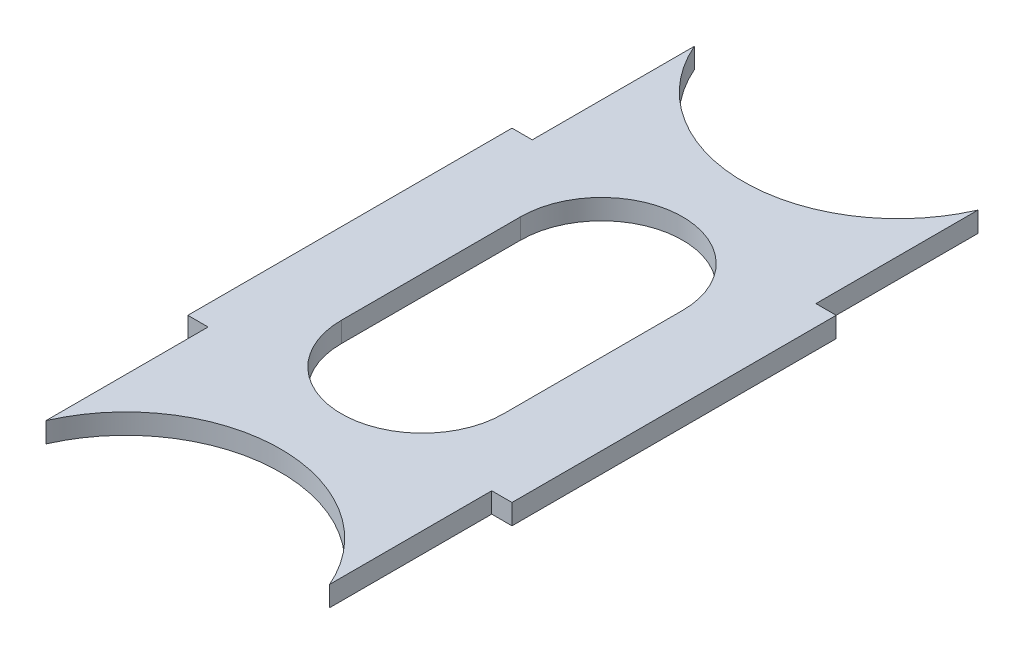
ISO-10303-21;
HEADER;
FILE_DESCRIPTION(('STEP AP214'),'2;1');
FILE_NAME('part.step','',(''),(''),'','','');
FILE_SCHEMA(('AUTOMOTIVE_DESIGN { 1 0 10303 214 1 1 1 1 }'));
ENDSEC;
DATA;
#1=APPLICATION_CONTEXT('core data for automotive mechanical design processes');
#2=APPLICATION_PROTOCOL_DEFINITION('international standard','automotive_design',2000,#1);
#3=PRODUCT_CONTEXT('',#1,'mechanical');
#4=PRODUCT('Part','Part','',(#3));
#5=PRODUCT_RELATED_PRODUCT_CATEGORY('part','',(#4));
#6=PRODUCT_DEFINITION_FORMATION('','',#4);
#7=PRODUCT_DEFINITION_CONTEXT('part definition',#1,'design');
#8=PRODUCT_DEFINITION('design','',#6,#7);
#9=PRODUCT_DEFINITION_SHAPE('','',#8);
#10=(LENGTH_UNIT() NAMED_UNIT(*) SI_UNIT(.MILLI.,.METRE.));
#11=(NAMED_UNIT(*) PLANE_ANGLE_UNIT() SI_UNIT($,.RADIAN.));
#12=(NAMED_UNIT(*) SI_UNIT($,.STERADIAN.) SOLID_ANGLE_UNIT());
#13=UNCERTAINTY_MEASURE_WITH_UNIT(LENGTH_MEASURE(1.E-05),#10,'distance_accuracy_value','');
#14=(GEOMETRIC_REPRESENTATION_CONTEXT(3) GLOBAL_UNCERTAINTY_ASSIGNED_CONTEXT((#13)) GLOBAL_UNIT_ASSIGNED_CONTEXT((#10,
#11,#12)) REPRESENTATION_CONTEXT('',''));
#15=CARTESIAN_POINT('',(0.,0.,0.));
#16=DIRECTION('',(0.,0.,1.));
#17=DIRECTION('',(1.,0.,0.));
#18=AXIS2_PLACEMENT_3D('',#15,#16,#17);
#19=CARTESIAN_POINT('',(0.,1.5875,-30.26171875));
#20=DIRECTION('',(0.,-1.,0.));
#21=DIRECTION('',(0.,0.,-1.));
#22=AXIS2_PLACEMENT_3D('',#19,#20,#21);
#23=CYLINDRICAL_SURFACE('',#22,12.1294668248073);
#24=CARTESIAN_POINT('',(0.,0.,-30.26171875));
#25=DIRECTION('',(0.,1.,0.));
#26=DIRECTION('',(0.,0.,1.));
#27=AXIS2_PLACEMENT_3D('',#24,#25,#26);
#28=CIRCLE('',#27,12.1294668248073);
#29=CARTESIAN_POINT('',(-11.1125,0.,-25.4));
#30=VERTEX_POINT('',#29);
#31=CARTESIAN_POINT('',(11.1125,0.,-25.4));
#32=VERTEX_POINT('',#31);
#33=EDGE_CURVE('E235',#30,#32,#28,.T.);
#34=ORIENTED_EDGE('',*,*,#33,.F.);
#35=DIRECTION('',(0.,-1.,0.));
#36=VECTOR('',#35,1.);
#37=CARTESIAN_POINT('',(-11.1125,1.5875,-25.4));
#38=LINE('',#37,#36);
#39=CARTESIAN_POINT('',(-11.1125,1.5875,-25.4));
#40=VERTEX_POINT('',#39);
#41=EDGE_CURVE('E11',#40,#30,#38,.T.);
#42=ORIENTED_EDGE('',*,*,#41,.F.);
#43=CARTESIAN_POINT('',(0.,1.5875,-30.26171875));
#44=DIRECTION('',(0.,1.,0.));
#45=DIRECTION('',(0.,0.,1.));
#46=AXIS2_PLACEMENT_3D('',#43,#44,#45);
#47=CIRCLE('',#46,12.1294668248073);
#48=CARTESIAN_POINT('',(11.1125,1.5875,-25.4));
#49=VERTEX_POINT('',#48);
#50=EDGE_CURVE('E268',#40,#49,#47,.T.);
#51=ORIENTED_EDGE('',*,*,#50,.T.);
#52=DIRECTION('',(0.,-1.,0.));
#53=VECTOR('',#52,1.);
#54=CARTESIAN_POINT('',(11.1125,1.5875,-25.4));
#55=LINE('',#54,#53);
#56=EDGE_CURVE('E55',#49,#32,#55,.T.);
#57=ORIENTED_EDGE('',*,*,#56,.T.);
#58=EDGE_LOOP('',(#34,#42,#51,#57));
#59=FACE_BOUND('',#58,.T.);
#60=ADVANCED_FACE('F36',(#59),#23,.F.);
#61=CARTESIAN_POINT('',(-11.1125,1.5875,0.));
#62=DIRECTION('',(1.,0.,0.));
#63=DIRECTION('',(0.,0.,-1.));
#64=AXIS2_PLACEMENT_3D('',#61,#62,#63);
#65=PLANE('',#64);
#66=DIRECTION('',(0.,0.,1.));
#67=VECTOR('',#66,1.);
#68=CARTESIAN_POINT('',(-11.1125,0.,0.));
#69=LINE('',#68,#67);
#70=CARTESIAN_POINT('',(-11.1125,0.,-12.7));
#71=VERTEX_POINT('',#70);
#72=EDGE_CURVE('E232',#30,#71,#69,.T.);
#73=ORIENTED_EDGE('',*,*,#72,.T.);
#74=DIRECTION('',(0.,-1.,0.));
#75=VECTOR('',#74,1.);
#76=CARTESIAN_POINT('',(-11.1125,1.5875,-12.7));
#77=LINE('',#76,#75);
#78=CARTESIAN_POINT('',(-11.1125,1.5875,-12.7));
#79=VERTEX_POINT('',#78);
#80=EDGE_CURVE('E46',#79,#71,#77,.T.);
#81=ORIENTED_EDGE('',*,*,#80,.F.);
#82=DIRECTION('',(0.,0.,1.));
#83=VECTOR('',#82,1.);
#84=CARTESIAN_POINT('',(-11.1125,1.5875,0.));
#85=LINE('',#84,#83);
#86=EDGE_CURVE('E266',#40,#79,#85,.T.);
#87=ORIENTED_EDGE('',*,*,#86,.F.);
#88=ORIENTED_EDGE('',*,*,#41,.T.);
#89=EDGE_LOOP('',(#73,#81,#87,#88));
#90=FACE_BOUND('',#89,.T.);
#91=ADVANCED_FACE('F302',(#90),#65,.F.);
#92=CARTESIAN_POINT('',(0.,1.5875,-12.7));
#93=DIRECTION('',(0.,0.,-1.));
#94=DIRECTION('',(-1.,0.,0.));
#95=AXIS2_PLACEMENT_3D('',#92,#93,#94);
#96=PLANE('',#95);
#97=DIRECTION('',(1.,0.,0.));
#98=VECTOR('',#97,1.);
#99=CARTESIAN_POINT('',(0.,0.,-12.7));
#100=LINE('',#99,#98);
#101=CARTESIAN_POINT('',(-12.7,0.,-12.7));
#102=VERTEX_POINT('',#101);
#103=EDGE_CURVE('E229',#102,#71,#100,.T.);
#104=ORIENTED_EDGE('',*,*,#103,.F.);
#105=DIRECTION('',(0.,-1.,0.));
#106=VECTOR('',#105,1.);
#107=CARTESIAN_POINT('',(-12.7,1.5875,-12.7));
#108=LINE('',#107,#106);
#109=CARTESIAN_POINT('',(-12.7,1.5875,-12.7));
#110=VERTEX_POINT('',#109);
#111=EDGE_CURVE('E195',#110,#102,#108,.T.);
#112=ORIENTED_EDGE('',*,*,#111,.F.);
#113=DIRECTION('',(1.,0.,0.));
#114=VECTOR('',#113,1.);
#115=CARTESIAN_POINT('',(0.,1.5875,-12.7));
#116=LINE('',#115,#114);
#117=EDGE_CURVE('E263',#110,#79,#116,.T.);
#118=ORIENTED_EDGE('',*,*,#117,.T.);
#119=ORIENTED_EDGE('',*,*,#80,.T.);
#120=EDGE_LOOP('',(#104,#112,#118,#119));
#121=FACE_BOUND('',#120,.T.);
#122=ADVANCED_FACE('F307',(#121),#96,.T.);
#123=CARTESIAN_POINT('',(-12.7,1.5875,0.));
#124=DIRECTION('',(-1.,0.,0.));
#125=DIRECTION('',(0.,0.,1.));
#126=AXIS2_PLACEMENT_3D('',#123,#124,#125);
#127=PLANE('',#126);
#128=DIRECTION('',(0.,0.,-1.));
#129=VECTOR('',#128,1.);
#130=CARTESIAN_POINT('',(-12.7,0.,0.));
#131=LINE('',#130,#129);
#132=CARTESIAN_POINT('',(-12.7,0.,12.7));
#133=VERTEX_POINT('',#132);
#134=EDGE_CURVE('E226',#133,#102,#131,.T.);
#135=ORIENTED_EDGE('',*,*,#134,.F.);
#136=DIRECTION('',(0.,-1.,0.));
#137=VECTOR('',#136,1.);
#138=CARTESIAN_POINT('',(-12.7,1.5875,12.7));
#139=LINE('',#138,#137);
#140=CARTESIAN_POINT('',(-12.7,1.5875,12.7));
#141=VERTEX_POINT('',#140);
#142=EDGE_CURVE('E193',#141,#133,#139,.T.);
#143=ORIENTED_EDGE('',*,*,#142,.F.);
#144=DIRECTION('',(0.,0.,-1.));
#145=VECTOR('',#144,1.);
#146=CARTESIAN_POINT('',(-12.7,1.5875,0.));
#147=LINE('',#146,#145);
#148=EDGE_CURVE('E260',#141,#110,#147,.T.);
#149=ORIENTED_EDGE('',*,*,#148,.T.);
#150=ORIENTED_EDGE('',*,*,#111,.T.);
#151=EDGE_LOOP('',(#135,#143,#149,#150));
#152=FACE_BOUND('',#151,.T.);
#153=ADVANCED_FACE('F419',(#152),#127,.T.);
#154=CARTESIAN_POINT('',(0.,1.5875,12.7));
#155=DIRECTION('',(0.,0.,1.));
#156=DIRECTION('',(1.,0.,0.));
#157=AXIS2_PLACEMENT_3D('',#154,#155,#156);
#158=PLANE('',#157);
#159=DIRECTION('',(-1.,0.,0.));
#160=VECTOR('',#159,1.);
#161=CARTESIAN_POINT('',(0.,0.,12.7));
#162=LINE('',#161,#160);
#163=CARTESIAN_POINT('',(-11.1125,0.,12.7));
#164=VERTEX_POINT('',#163);
#165=EDGE_CURVE('E223',#164,#133,#162,.T.);
#166=ORIENTED_EDGE('',*,*,#165,.F.);
#167=DIRECTION('',(0.,-1.,0.));
#168=VECTOR('',#167,1.);
#169=CARTESIAN_POINT('',(-11.1125,1.5875,12.7));
#170=LINE('',#169,#168);
#171=CARTESIAN_POINT('',(-11.1125,1.5875,12.7));
#172=VERTEX_POINT('',#171);
#173=EDGE_CURVE('E191',#172,#164,#170,.T.);
#174=ORIENTED_EDGE('',*,*,#173,.F.);
#175=DIRECTION('',(-1.,0.,0.));
#176=VECTOR('',#175,1.);
#177=CARTESIAN_POINT('',(0.,1.5875,12.7));
#178=LINE('',#177,#176);
#179=EDGE_CURVE('E257',#172,#141,#178,.T.);
#180=ORIENTED_EDGE('',*,*,#179,.T.);
#181=ORIENTED_EDGE('',*,*,#142,.T.);
#182=EDGE_LOOP('',(#166,#174,#180,#181));
#183=FACE_BOUND('',#182,.T.);
#184=ADVANCED_FACE('F410',(#183),#158,.T.);
#185=CARTESIAN_POINT('',(-11.1125,0.,25.4));
#186=VERTEX_POINT('',#185);
#187=EDGE_CURVE('E222',#164,#186,#69,.T.);
#188=ORIENTED_EDGE('',*,*,#187,.T.);
#189=DIRECTION('',(0.,-1.,0.));
#190=VECTOR('',#189,1.);
#191=CARTESIAN_POINT('',(-11.1125,1.5875,25.4));
#192=LINE('',#191,#190);
#193=CARTESIAN_POINT('',(-11.1125,1.5875,25.4));
#194=VERTEX_POINT('',#193);
#195=EDGE_CURVE('E189',#194,#186,#192,.T.);
#196=ORIENTED_EDGE('',*,*,#195,.F.);
#197=EDGE_CURVE('E256',#172,#194,#85,.T.);
#198=ORIENTED_EDGE('',*,*,#197,.F.);
#199=ORIENTED_EDGE('',*,*,#173,.T.);
#200=EDGE_LOOP('',(#188,#196,#198,#199));
#201=FACE_BOUND('',#200,.T.);
#202=ADVANCED_FACE('F310',(#201),#65,.F.);
#203=CARTESIAN_POINT('',(0.,1.5875,30.26171875));
#204=DIRECTION('',(0.,-1.,0.));
#205=DIRECTION('',(0.,0.,-1.));
#206=AXIS2_PLACEMENT_3D('',#203,#204,#205);
#207=CYLINDRICAL_SURFACE('',#206,12.1294668248073);
#208=CARTESIAN_POINT('',(0.,0.,30.26171875));
#209=DIRECTION('',(0.,1.,0.));
#210=DIRECTION('',(0.,0.,1.));
#211=AXIS2_PLACEMENT_3D('',#208,#209,#210);
#212=CIRCLE('',#211,12.1294668248073);
#213=CARTESIAN_POINT('',(11.1125,0.,25.4));
#214=VERTEX_POINT('',#213);
#215=EDGE_CURVE('E219',#214,#186,#212,.T.);
#216=ORIENTED_EDGE('',*,*,#215,.F.);
#217=DIRECTION('',(0.,-1.,0.));
#218=VECTOR('',#217,1.);
#219=CARTESIAN_POINT('',(11.1125,1.5875,25.4));
#220=LINE('',#219,#218);
#221=CARTESIAN_POINT('',(11.1125,1.5875,25.4));
#222=VERTEX_POINT('',#221);
#223=EDGE_CURVE('E187',#222,#214,#220,.T.);
#224=ORIENTED_EDGE('',*,*,#223,.F.);
#225=CARTESIAN_POINT('',(0.,1.5875,30.26171875));
#226=DIRECTION('',(0.,1.,0.));
#227=DIRECTION('',(0.,0.,1.));
#228=AXIS2_PLACEMENT_3D('',#225,#226,#227);
#229=CIRCLE('',#228,12.1294668248073);
#230=EDGE_CURVE('E253',#222,#194,#229,.T.);
#231=ORIENTED_EDGE('',*,*,#230,.T.);
#232=ORIENTED_EDGE('',*,*,#195,.T.);
#233=EDGE_LOOP('',(#216,#224,#231,#232));
#234=FACE_BOUND('',#233,.T.);
#235=ADVANCED_FACE('F299',(#234),#207,.F.);
#236=CARTESIAN_POINT('',(11.1125,1.5875,0.));
#237=DIRECTION('',(1.,0.,0.));
#238=DIRECTION('',(0.,0.,-1.));
#239=AXIS2_PLACEMENT_3D('',#236,#237,#238);
#240=PLANE('',#239);
#241=DIRECTION('',(0.,0.,1.));
#242=VECTOR('',#241,1.);
#243=CARTESIAN_POINT('',(11.1125,0.,0.));
#244=LINE('',#243,#242);
#245=CARTESIAN_POINT('',(11.1125,0.,12.7));
#246=VERTEX_POINT('',#245);
#247=EDGE_CURVE('E216',#246,#214,#244,.T.);
#248=ORIENTED_EDGE('',*,*,#247,.F.);
#249=DIRECTION('',(0.,-1.,0.));
#250=VECTOR('',#249,1.);
#251=CARTESIAN_POINT('',(11.1125,1.5875,12.7));
#252=LINE('',#251,#250);
#253=CARTESIAN_POINT('',(11.1125,1.5875,12.7));
#254=VERTEX_POINT('',#253);
#255=EDGE_CURVE('E181',#254,#246,#252,.T.);
#256=ORIENTED_EDGE('',*,*,#255,.F.);
#257=DIRECTION('',(0.,0.,1.));
#258=VECTOR('',#257,1.);
#259=CARTESIAN_POINT('',(11.1125,1.5875,0.));
#260=LINE('',#259,#258);
#261=EDGE_CURVE('E250',#254,#222,#260,.T.);
#262=ORIENTED_EDGE('',*,*,#261,.T.);
#263=ORIENTED_EDGE('',*,*,#223,.T.);
#264=EDGE_LOOP('',(#248,#256,#262,#263));
#265=FACE_BOUND('',#264,.T.);
#266=ADVANCED_FACE('F285',(#265),#240,.T.);
#267=CARTESIAN_POINT('',(0.,1.5875,12.7));
#268=DIRECTION('',(0.,0.,-1.));
#269=DIRECTION('',(-1.,0.,0.));
#270=AXIS2_PLACEMENT_3D('',#267,#268,#269);
#271=PLANE('',#270);
#272=DIRECTION('',(1.,0.,0.));
#273=VECTOR('',#272,1.);
#274=CARTESIAN_POINT('',(0.,0.,12.7));
#275=LINE('',#274,#273);
#276=CARTESIAN_POINT('',(12.7,0.,12.7));
#277=VERTEX_POINT('',#276);
#278=EDGE_CURVE('E213',#246,#277,#275,.T.);
#279=ORIENTED_EDGE('',*,*,#278,.T.);
#280=DIRECTION('',(0.,-1.,0.));
#281=VECTOR('',#280,1.);
#282=CARTESIAN_POINT('',(12.7,1.5875,12.7));
#283=LINE('',#282,#281);
#284=CARTESIAN_POINT('',(12.7,1.5875,12.7));
#285=VERTEX_POINT('',#284);
#286=EDGE_CURVE('E179',#285,#277,#283,.T.);
#287=ORIENTED_EDGE('',*,*,#286,.F.);
#288=DIRECTION('',(1.,0.,0.));
#289=VECTOR('',#288,1.);
#290=CARTESIAN_POINT('',(0.,1.5875,12.7));
#291=LINE('',#290,#289);
#292=EDGE_CURVE('E172',#254,#285,#291,.T.);
#293=ORIENTED_EDGE('',*,*,#292,.F.);
#294=ORIENTED_EDGE('',*,*,#255,.T.);
#295=EDGE_LOOP('',(#279,#287,#293,#294));
#296=FACE_BOUND('',#295,.T.);
#297=ADVANCED_FACE('F298',(#296),#271,.F.);
#298=CARTESIAN_POINT('',(12.7,1.5875,0.));
#299=DIRECTION('',(-1.,0.,0.));
#300=DIRECTION('',(0.,0.,1.));
#301=AXIS2_PLACEMENT_3D('',#298,#299,#300);
#302=PLANE('',#301);
#303=DIRECTION('',(0.,0.,-1.));
#304=VECTOR('',#303,1.);
#305=CARTESIAN_POINT('',(12.7,0.,0.));
#306=LINE('',#305,#304);
#307=CARTESIAN_POINT('',(12.7,0.,-12.7));
#308=VERTEX_POINT('',#307);
#309=EDGE_CURVE('E178',#277,#308,#306,.T.);
#310=ORIENTED_EDGE('',*,*,#309,.T.);
#311=DIRECTION('',(0.,-1.,0.));
#312=VECTOR('',#311,1.);
#313=CARTESIAN_POINT('',(12.7,1.5875,-12.7));
#314=LINE('',#313,#312);
#315=CARTESIAN_POINT('',(12.7,1.5875,-12.7));
#316=VERTEX_POINT('',#315);
#317=EDGE_CURVE('E160',#316,#308,#314,.T.);
#318=ORIENTED_EDGE('',*,*,#317,.F.);
#319=DIRECTION('',(0.,0.,-1.));
#320=VECTOR('',#319,1.);
#321=CARTESIAN_POINT('',(12.7,1.5875,0.));
#322=LINE('',#321,#320);
#323=EDGE_CURVE('E165',#285,#316,#322,.T.);
#324=ORIENTED_EDGE('',*,*,#323,.F.);
#325=ORIENTED_EDGE('',*,*,#286,.T.);
#326=EDGE_LOOP('',(#310,#318,#324,#325));
#327=FACE_BOUND('',#326,.T.);
#328=ADVANCED_FACE('F177',(#327),#302,.F.);
#329=CARTESIAN_POINT('',(0.,1.5875,-12.7));
#330=DIRECTION('',(0.,0.,1.));
#331=DIRECTION('',(1.,0.,0.));
#332=AXIS2_PLACEMENT_3D('',#329,#330,#331);
#333=PLANE('',#332);
#334=DIRECTION('',(-1.,0.,0.));
#335=VECTOR('',#334,1.);
#336=CARTESIAN_POINT('',(0.,0.,-12.7));
#337=LINE('',#336,#335);
#338=CARTESIAN_POINT('',(11.1125,0.,-12.7));
#339=VERTEX_POINT('',#338);
#340=EDGE_CURVE('E209',#308,#339,#337,.T.);
#341=ORIENTED_EDGE('',*,*,#340,.T.);
#342=DIRECTION('',(0.,-1.,0.));
#343=VECTOR('',#342,1.);
#344=CARTESIAN_POINT('',(11.1125,1.5875,-12.7));
#345=LINE('',#344,#343);
#346=CARTESIAN_POINT('',(11.1125,1.5875,-12.7));
#347=VERTEX_POINT('',#346);
#348=EDGE_CURVE('E105',#347,#339,#345,.T.);
#349=ORIENTED_EDGE('',*,*,#348,.F.);
#350=DIRECTION('',(-1.,0.,0.));
#351=VECTOR('',#350,1.);
#352=CARTESIAN_POINT('',(0.,1.5875,-12.7));
#353=LINE('',#352,#351);
#354=EDGE_CURVE('E156',#316,#347,#353,.T.);
#355=ORIENTED_EDGE('',*,*,#354,.F.);
#356=ORIENTED_EDGE('',*,*,#317,.T.);
#357=EDGE_LOOP('',(#341,#349,#355,#356));
#358=FACE_BOUND('',#357,.T.);
#359=ADVANCED_FACE('F158',(#358),#333,.F.);
#360=CARTESIAN_POINT('',(0.,1.5875,7.01975192519267));
#361=DIRECTION('',(0.,-1.,0.));
#362=DIRECTION('',(0.,0.,-1.));
#363=AXIS2_PLACEMENT_3D('',#360,#361,#362);
#364=CYLINDRICAL_SURFACE('',#363,6.35);
#365=CARTESIAN_POINT('',(0.,0.,7.01975192519267));
#366=DIRECTION('',(0.,1.,0.));
#367=DIRECTION('',(0.,0.,1.));
#368=AXIS2_PLACEMENT_3D('',#365,#366,#367);
#369=CIRCLE('',#368,6.35);
#370=CARTESIAN_POINT('',(-6.35,0.,7.01975192519267));
#371=VERTEX_POINT('',#370);
#372=CARTESIAN_POINT('',(6.35,0.,7.01975192519267));
#373=VERTEX_POINT('',#372);
#374=EDGE_CURVE('E246',#371,#373,#369,.T.);
#375=ORIENTED_EDGE('',*,*,#374,.F.);
#376=DIRECTION('',(0.,-1.,0.));
#377=VECTOR('',#376,1.);
#378=CARTESIAN_POINT('',(-6.35,1.5875,7.01975192519267));
#379=LINE('',#378,#377);
#380=CARTESIAN_POINT('',(-6.35,1.5875,7.01975192519267));
#381=VERTEX_POINT('',#380);
#382=EDGE_CURVE('E40',#381,#371,#379,.T.);
#383=ORIENTED_EDGE('',*,*,#382,.F.);
#384=CARTESIAN_POINT('',(0.,1.5875,7.01975192519267));
#385=DIRECTION('',(0.,1.,0.));
#386=DIRECTION('',(0.,0.,1.));
#387=AXIS2_PLACEMENT_3D('',#384,#385,#386);
#388=CIRCLE('',#387,6.35);
#389=CARTESIAN_POINT('',(6.35,1.5875,7.01975192519267));
#390=VERTEX_POINT('',#389);
#391=EDGE_CURVE('E276',#381,#390,#388,.T.);
#392=ORIENTED_EDGE('',*,*,#391,.T.);
#393=DIRECTION('',(0.,-1.,0.));
#394=VECTOR('',#393,1.);
#395=CARTESIAN_POINT('',(6.35,1.5875,7.01975192519267));
#396=LINE('',#395,#394);
#397=EDGE_CURVE('E198',#390,#373,#396,.T.);
#398=ORIENTED_EDGE('',*,*,#397,.T.);
#399=EDGE_LOOP('',(#375,#383,#392,#398));
#400=FACE_BOUND('',#399,.T.);
#401=ADVANCED_FACE('F38',(#400),#364,.F.);
#402=CARTESIAN_POINT('',(-6.35,1.5875,0.));
#403=DIRECTION('',(1.,0.,0.));
#404=DIRECTION('',(0.,0.,-1.));
#405=AXIS2_PLACEMENT_3D('',#402,#403,#404);
#406=PLANE('',#405);
#407=DIRECTION('',(0.,0.,1.));
#408=VECTOR('',#407,1.);
#409=CARTESIAN_POINT('',(-6.35,0.,0.));
#410=LINE('',#409,#408);
#411=CARTESIAN_POINT('',(-6.35,0.,-7.01975192519267));
#412=VERTEX_POINT('',#411);
#413=EDGE_CURVE('E243',#412,#371,#410,.T.);
#414=ORIENTED_EDGE('',*,*,#413,.F.);
#415=DIRECTION('',(0.,-1.,0.));
#416=VECTOR('',#415,1.);
#417=CARTESIAN_POINT('',(-6.35,1.5875,-7.01975192519267));
#418=LINE('',#417,#416);
#419=CARTESIAN_POINT('',(-6.35,1.5875,-7.01975192519267));
#420=VERTEX_POINT('',#419);
#421=EDGE_CURVE('E201',#420,#412,#418,.T.);
#422=ORIENTED_EDGE('',*,*,#421,.F.);
#423=DIRECTION('',(0.,0.,1.));
#424=VECTOR('',#423,1.);
#425=CARTESIAN_POINT('',(-6.35,1.5875,0.));
#426=LINE('',#425,#424);
#427=EDGE_CURVE('E274',#420,#381,#426,.T.);
#428=ORIENTED_EDGE('',*,*,#427,.T.);
#429=ORIENTED_EDGE('',*,*,#382,.T.);
#430=EDGE_LOOP('',(#414,#422,#428,#429));
#431=FACE_BOUND('',#430,.T.);
#432=ADVANCED_FACE('F315',(#431),#406,.T.);
#433=CARTESIAN_POINT('',(0.,1.5875,-7.01975192519267));
#434=DIRECTION('',(0.,-1.,0.));
#435=DIRECTION('',(0.,0.,-1.));
#436=AXIS2_PLACEMENT_3D('',#433,#434,#435);
#437=CYLINDRICAL_SURFACE('',#436,6.35);
#438=CARTESIAN_POINT('',(0.,0.,-7.01975192519267));
#439=DIRECTION('',(0.,1.,0.));
#440=DIRECTION('',(0.,0.,1.));
#441=AXIS2_PLACEMENT_3D('',#438,#439,#440);
#442=CIRCLE('',#441,6.35);
#443=CARTESIAN_POINT('',(6.35,0.,-7.01975192519267));
#444=VERTEX_POINT('',#443);
#445=EDGE_CURVE('E240',#444,#412,#442,.T.);
#446=ORIENTED_EDGE('',*,*,#445,.F.);
#447=DIRECTION('',(0.,-1.,0.));
#448=VECTOR('',#447,1.);
#449=CARTESIAN_POINT('',(6.35,1.5875,-7.01975192519267));
#450=LINE('',#449,#448);
#451=CARTESIAN_POINT('',(6.35,1.5875,-7.01975192519267));
#452=VERTEX_POINT('',#451);
#453=EDGE_CURVE('E200',#452,#444,#450,.T.);
#454=ORIENTED_EDGE('',*,*,#453,.F.);
#455=CARTESIAN_POINT('',(0.,1.5875,-7.01975192519267));
#456=DIRECTION('',(0.,1.,0.));
#457=DIRECTION('',(0.,0.,1.));
#458=AXIS2_PLACEMENT_3D('',#455,#456,#457);
#459=CIRCLE('',#458,6.35);
#460=EDGE_CURVE('E272',#452,#420,#459,.T.);
#461=ORIENTED_EDGE('',*,*,#460,.T.);
#462=ORIENTED_EDGE('',*,*,#421,.T.);
#463=EDGE_LOOP('',(#446,#454,#461,#462));
#464=FACE_BOUND('',#463,.T.);
#465=ADVANCED_FACE('F292',(#464),#437,.F.);
#466=CARTESIAN_POINT('',(6.35,1.5875,0.));
#467=DIRECTION('',(1.,0.,0.));
#468=DIRECTION('',(0.,0.,-1.));
#469=AXIS2_PLACEMENT_3D('',#466,#467,#468);
#470=PLANE('',#469);
#471=DIRECTION('',(0.,0.,1.));
#472=VECTOR('',#471,1.);
#473=CARTESIAN_POINT('',(6.35,0.,0.));
#474=LINE('',#473,#472);
#475=EDGE_CURVE('E237',#444,#373,#474,.T.);
#476=ORIENTED_EDGE('',*,*,#475,.T.);
#477=ORIENTED_EDGE('',*,*,#397,.F.);
#478=DIRECTION('',(0.,0.,1.));
#479=VECTOR('',#478,1.);
#480=CARTESIAN_POINT('',(6.35,1.5875,0.));
#481=LINE('',#480,#479);
#482=EDGE_CURVE('E270',#452,#390,#481,.T.);
#483=ORIENTED_EDGE('',*,*,#482,.F.);
#484=ORIENTED_EDGE('',*,*,#453,.T.);
#485=EDGE_LOOP('',(#476,#477,#483,#484));
#486=FACE_BOUND('',#485,.T.);
#487=ADVANCED_FACE('F283',(#486),#470,.F.);
#488=EDGE_CURVE('E211',#32,#339,#244,.T.);
#489=ORIENTED_EDGE('',*,*,#488,.F.);
#490=ORIENTED_EDGE('',*,*,#56,.F.);
#491=EDGE_CURVE('E164',#49,#347,#260,.T.);
#492=ORIENTED_EDGE('',*,*,#491,.T.);
#493=ORIENTED_EDGE('',*,*,#348,.T.);
#494=EDGE_LOOP('',(#489,#490,#492,#493));
#495=FACE_BOUND('',#494,.T.);
#496=ADVANCED_FACE('F281',(#495),#240,.T.);
#497=CARTESIAN_POINT('',(0.,1.5875,0.));
#498=DIRECTION('',(0.,1.,0.));
#499=DIRECTION('',(0.,0.,1.));
#500=AXIS2_PLACEMENT_3D('',#497,#498,#499);
#501=PLANE('',#500);
#502=ORIENTED_EDGE('',*,*,#391,.F.);
#503=ORIENTED_EDGE('',*,*,#427,.F.);
#504=ORIENTED_EDGE('',*,*,#460,.F.);
#505=ORIENTED_EDGE('',*,*,#482,.T.);
#506=EDGE_LOOP('',(#502,#503,#504,#505));
#507=FACE_BOUND('',#506,.T.);
#508=ORIENTED_EDGE('',*,*,#50,.F.);
#509=ORIENTED_EDGE('',*,*,#86,.T.);
#510=ORIENTED_EDGE('',*,*,#117,.F.);
#511=ORIENTED_EDGE('',*,*,#148,.F.);
#512=ORIENTED_EDGE('',*,*,#179,.F.);
#513=ORIENTED_EDGE('',*,*,#197,.T.);
#514=ORIENTED_EDGE('',*,*,#230,.F.);
#515=ORIENTED_EDGE('',*,*,#261,.F.);
#516=ORIENTED_EDGE('',*,*,#292,.T.);
#517=ORIENTED_EDGE('',*,*,#323,.T.);
#518=ORIENTED_EDGE('',*,*,#354,.T.);
#519=ORIENTED_EDGE('',*,*,#491,.F.);
#520=EDGE_LOOP('',(#508,#509,#510,#511,#512,#513,#514,#515,#516,#517,#518,#519));
#521=FACE_BOUND('',#520,.T.);
#522=ADVANCED_FACE('F169',(#507,#521),#501,.T.);
#523=CARTESIAN_POINT('',(0.,0.,0.));
#524=DIRECTION('',(0.,1.,0.));
#525=DIRECTION('',(0.,0.,1.));
#526=AXIS2_PLACEMENT_3D('',#523,#524,#525);
#527=PLANE('',#526);
#528=ORIENTED_EDGE('',*,*,#374,.T.);
#529=ORIENTED_EDGE('',*,*,#475,.F.);
#530=ORIENTED_EDGE('',*,*,#445,.T.);
#531=ORIENTED_EDGE('',*,*,#413,.T.);
#532=EDGE_LOOP('',(#528,#529,#530,#531));
#533=FACE_BOUND('',#532,.T.);
#534=ORIENTED_EDGE('',*,*,#33,.T.);
#535=ORIENTED_EDGE('',*,*,#488,.T.);
#536=ORIENTED_EDGE('',*,*,#340,.F.);
#537=ORIENTED_EDGE('',*,*,#309,.F.);
#538=ORIENTED_EDGE('',*,*,#278,.F.);
#539=ORIENTED_EDGE('',*,*,#247,.T.);
#540=ORIENTED_EDGE('',*,*,#215,.T.);
#541=ORIENTED_EDGE('',*,*,#187,.F.);
#542=ORIENTED_EDGE('',*,*,#165,.T.);
#543=ORIENTED_EDGE('',*,*,#134,.T.);
#544=ORIENTED_EDGE('',*,*,#103,.T.);
#545=ORIENTED_EDGE('',*,*,#72,.F.);
#546=EDGE_LOOP('',(#534,#535,#536,#537,#538,#539,#540,#541,#542,#543,#544,#545));
#547=FACE_BOUND('',#546,.T.);
#548=ADVANCED_FACE('F279',(#533,#547),#527,.F.);
#549=CLOSED_SHELL('',(#60,#91,#122,#153,#184,#202,#235,#266,#297,#328,#359,#401,#432,#465,#487,
#496,#522,#548));
#550=MANIFOLD_SOLID_BREP('B2',#549);
#551=ADVANCED_BREP_SHAPE_REPRESENTATION('',(#18,#550),#14);
#552=SHAPE_DEFINITION_REPRESENTATION(#9,#551);
ENDSEC;
END-ISO-10303-21;
